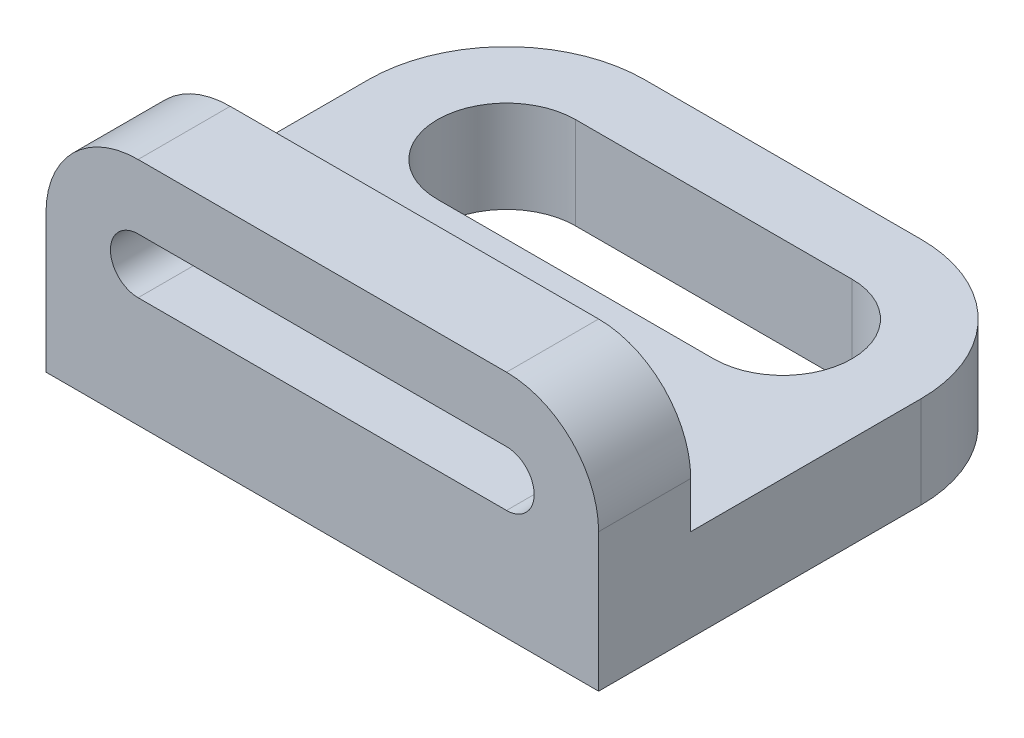
ISO-10303-21;
HEADER;
FILE_DESCRIPTION(('STEP AP214'),'2;1');
FILE_NAME('part.step','',(''),(''),'','','');
FILE_SCHEMA(('AUTOMOTIVE_DESIGN { 1 0 10303 214 1 1 1 1 }'));
ENDSEC;
DATA;
#1=APPLICATION_CONTEXT('core data for automotive mechanical design processes');
#2=APPLICATION_PROTOCOL_DEFINITION('international standard','automotive_design',2000,#1);
#3=PRODUCT_CONTEXT('',#1,'mechanical');
#4=PRODUCT('Part','Part','',(#3));
#5=PRODUCT_RELATED_PRODUCT_CATEGORY('part','',(#4));
#6=PRODUCT_DEFINITION_FORMATION('','',#4);
#7=PRODUCT_DEFINITION_CONTEXT('part definition',#1,'design');
#8=PRODUCT_DEFINITION('design','',#6,#7);
#9=PRODUCT_DEFINITION_SHAPE('','',#8);
#10=(LENGTH_UNIT() NAMED_UNIT(*) SI_UNIT(.MILLI.,.METRE.));
#11=(NAMED_UNIT(*) PLANE_ANGLE_UNIT() SI_UNIT($,.RADIAN.));
#12=(NAMED_UNIT(*) SI_UNIT($,.STERADIAN.) SOLID_ANGLE_UNIT());
#13=UNCERTAINTY_MEASURE_WITH_UNIT(LENGTH_MEASURE(1.E-05),#10,'distance_accuracy_value','');
#14=(GEOMETRIC_REPRESENTATION_CONTEXT(3) GLOBAL_UNCERTAINTY_ASSIGNED_CONTEXT((#13)) GLOBAL_UNIT_ASSIGNED_CONTEXT((#10,
#11,#12)) REPRESENTATION_CONTEXT('',''));
#15=CARTESIAN_POINT('',(0.,0.,0.));
#16=DIRECTION('',(0.,0.,1.));
#17=DIRECTION('',(1.,0.,0.));
#18=AXIS2_PLACEMENT_3D('',#15,#16,#17);
#19=CARTESIAN_POINT('',(120.,50.,0.));
#20=DIRECTION('',(0.,0.,-1.));
#21=DIRECTION('',(0.,1.,0.));
#22=AXIS2_PLACEMENT_3D('',#19,#20,#21);
#23=PLANE('',#22);
#24=DIRECTION('',(-1.,0.,0.));
#25=VECTOR('',#24,1.);
#26=CARTESIAN_POINT('',(20.,24.,0.));
#27=LINE('',#26,#25);
#28=CARTESIAN_POINT('',(100.,24.,0.));
#29=VERTEX_POINT('',#28);
#30=CARTESIAN_POINT('',(20.,24.,0.));
#31=VERTEX_POINT('',#30);
#32=EDGE_CURVE('E169',#29,#31,#27,.T.);
#33=ORIENTED_EDGE('',*,*,#32,.T.);
#34=CARTESIAN_POINT('',(20.,30.,0.));
#35=DIRECTION('',(0.,0.,-1.));
#36=DIRECTION('',(0.,1.,0.));
#37=AXIS2_PLACEMENT_3D('',#34,#35,#36);
#38=CIRCLE('',#37,6.);
#39=CARTESIAN_POINT('',(20.,36.,0.));
#40=VERTEX_POINT('',#39);
#41=EDGE_CURVE('E163',#31,#40,#38,.T.);
#42=ORIENTED_EDGE('',*,*,#41,.T.);
#43=DIRECTION('',(1.,0.,0.));
#44=VECTOR('',#43,1.);
#45=CARTESIAN_POINT('',(20.,36.,0.));
#46=LINE('',#45,#44);
#47=CARTESIAN_POINT('',(100.,36.,0.));
#48=VERTEX_POINT('',#47);
#49=EDGE_CURVE('E172',#40,#48,#46,.T.);
#50=ORIENTED_EDGE('',*,*,#49,.T.);
#51=CARTESIAN_POINT('',(100.,30.,0.));
#52=DIRECTION('',(0.,0.,-1.));
#53=DIRECTION('',(0.,1.,0.));
#54=AXIS2_PLACEMENT_3D('',#51,#52,#53);
#55=CIRCLE('',#54,6.);
#56=EDGE_CURVE('E52',#48,#29,#55,.T.);
#57=ORIENTED_EDGE('',*,*,#56,.T.);
#58=EDGE_LOOP('',(#33,#42,#50,#57));
#59=FACE_BOUND('',#58,.T.);
#60=DIRECTION('',(0.,-1.,0.));
#61=VECTOR('',#60,1.);
#62=CARTESIAN_POINT('',(120.,50.,0.));
#63=LINE('',#62,#61);
#64=CARTESIAN_POINT('',(120.,30.,0.));
#65=VERTEX_POINT('',#64);
#66=CARTESIAN_POINT('',(120.,0.,0.));
#67=VERTEX_POINT('',#66);
#68=EDGE_CURVE('E229',#65,#67,#63,.T.);
#69=ORIENTED_EDGE('',*,*,#68,.F.);
#70=CARTESIAN_POINT('',(100.,30.,0.));
#71=DIRECTION('',(0.,0.,-1.));
#72=DIRECTION('',(0.,1.,0.));
#73=AXIS2_PLACEMENT_3D('',#70,#71,#72);
#74=CIRCLE('',#73,20.);
#75=CARTESIAN_POINT('',(100.,50.,0.));
#76=VERTEX_POINT('',#75);
#77=EDGE_CURVE('E288',#65,#76,#74,.F.);
#78=ORIENTED_EDGE('',*,*,#77,.T.);
#79=DIRECTION('',(-1.,0.,0.));
#80=VECTOR('',#79,1.);
#81=CARTESIAN_POINT('',(120.,50.,0.));
#82=LINE('',#81,#80);
#83=CARTESIAN_POINT('',(20.,50.,0.));
#84=VERTEX_POINT('',#83);
#85=EDGE_CURVE('E240',#76,#84,#82,.T.);
#86=ORIENTED_EDGE('',*,*,#85,.T.);
#87=CARTESIAN_POINT('',(20.,30.,0.));
#88=DIRECTION('',(0.,0.,-1.));
#89=DIRECTION('',(0.,1.,0.));
#90=AXIS2_PLACEMENT_3D('',#87,#88,#89);
#91=CIRCLE('',#90,20.);
#92=CARTESIAN_POINT('',(0.,30.,0.));
#93=VERTEX_POINT('',#92);
#94=EDGE_CURVE('E286',#84,#93,#91,.F.);
#95=ORIENTED_EDGE('',*,*,#94,.T.);
#96=DIRECTION('',(0.,-1.,0.));
#97=VECTOR('',#96,1.);
#98=CARTESIAN_POINT('',(0.,50.,0.));
#99=LINE('',#98,#97);
#100=CARTESIAN_POINT('',(0.,0.,0.));
#101=VERTEX_POINT('',#100);
#102=EDGE_CURVE('E222',#93,#101,#99,.T.);
#103=ORIENTED_EDGE('',*,*,#102,.T.);
#104=DIRECTION('',(-1.,0.,0.));
#105=VECTOR('',#104,1.);
#106=CARTESIAN_POINT('',(120.,0.,0.));
#107=LINE('',#106,#105);
#108=EDGE_CURVE('E261',#67,#101,#107,.T.);
#109=ORIENTED_EDGE('',*,*,#108,.F.);
#110=EDGE_LOOP('',(#69,#78,#86,#95,#103,#109));
#111=FACE_BOUND('',#110,.T.);
#112=ADVANCED_FACE('F37',(#59,#111),#23,.F.);
#113=CARTESIAN_POINT('',(120.,0.,0.));
#114=DIRECTION('',(0.,1.,0.));
#115=DIRECTION('',(0.,0.,1.));
#116=AXIS2_PLACEMENT_3D('',#113,#114,#115);
#117=PLANE('',#116);
#118=DIRECTION('',(-1.,0.,0.));
#119=VECTOR('',#118,1.);
#120=CARTESIAN_POINT('',(30.,0.,-85.));
#121=LINE('',#120,#119);
#122=CARTESIAN_POINT('',(90.,0.,-85.));
#123=VERTEX_POINT('',#122);
#124=CARTESIAN_POINT('',(30.,0.,-85.));
#125=VERTEX_POINT('',#124);
#126=EDGE_CURVE('E207',#123,#125,#121,.T.);
#127=ORIENTED_EDGE('',*,*,#126,.T.);
#128=CARTESIAN_POINT('',(30.,0.,-70.));
#129=DIRECTION('',(0.,1.,0.));
#130=DIRECTION('',(0.,0.,1.));
#131=AXIS2_PLACEMENT_3D('',#128,#129,#130);
#132=CIRCLE('',#131,15.);
#133=CARTESIAN_POINT('',(30.,0.,-55.));
#134=VERTEX_POINT('',#133);
#135=EDGE_CURVE('E197',#125,#134,#132,.T.);
#136=ORIENTED_EDGE('',*,*,#135,.T.);
#137=DIRECTION('',(1.,0.,0.));
#138=VECTOR('',#137,1.);
#139=CARTESIAN_POINT('',(30.,0.,-55.));
#140=LINE('',#139,#138);
#141=CARTESIAN_POINT('',(90.,0.,-55.));
#142=VERTEX_POINT('',#141);
#143=EDGE_CURVE('E200',#134,#142,#140,.T.);
#144=ORIENTED_EDGE('',*,*,#143,.T.);
#145=CARTESIAN_POINT('',(90.,0.,-70.));
#146=DIRECTION('',(0.,1.,0.));
#147=DIRECTION('',(0.,0.,1.));
#148=AXIS2_PLACEMENT_3D('',#145,#146,#147);
#149=CIRCLE('',#148,15.);
#150=EDGE_CURVE('E204',#142,#123,#149,.T.);
#151=ORIENTED_EDGE('',*,*,#150,.T.);
#152=EDGE_LOOP('',(#127,#136,#144,#151));
#153=FACE_BOUND('',#152,.T.);
#154=DIRECTION('',(-1.,0.,0.));
#155=VECTOR('',#154,1.);
#156=CARTESIAN_POINT('',(120.,0.,-100.));
#157=LINE('',#156,#155);
#158=CARTESIAN_POINT('',(90.,0.,-100.));
#159=VERTEX_POINT('',#158);
#160=CARTESIAN_POINT('',(30.,0.,-100.));
#161=VERTEX_POINT('',#160);
#162=EDGE_CURVE('E259',#159,#161,#157,.T.);
#163=ORIENTED_EDGE('',*,*,#162,.F.);
#164=CARTESIAN_POINT('',(90.,0.,-70.));
#165=DIRECTION('',(0.,1.,0.));
#166=DIRECTION('',(0.,0.,1.));
#167=AXIS2_PLACEMENT_3D('',#164,#165,#166);
#168=CIRCLE('',#167,30.);
#169=CARTESIAN_POINT('',(120.,0.,-70.));
#170=VERTEX_POINT('',#169);
#171=EDGE_CURVE('E281',#159,#170,#168,.F.);
#172=ORIENTED_EDGE('',*,*,#171,.T.);
#173=DIRECTION('',(0.,0.,-1.));
#174=VECTOR('',#173,1.);
#175=CARTESIAN_POINT('',(120.,0.,0.));
#176=LINE('',#175,#174);
#177=EDGE_CURVE('E231',#67,#170,#176,.T.);
#178=ORIENTED_EDGE('',*,*,#177,.F.);
#179=ORIENTED_EDGE('',*,*,#108,.T.);
#180=DIRECTION('',(0.,0.,-1.));
#181=VECTOR('',#180,1.);
#182=CARTESIAN_POINT('',(0.,0.,0.));
#183=LINE('',#182,#181);
#184=CARTESIAN_POINT('',(0.,0.,-70.));
#185=VERTEX_POINT('',#184);
#186=EDGE_CURVE('E242',#101,#185,#183,.T.);
#187=ORIENTED_EDGE('',*,*,#186,.T.);
#188=CARTESIAN_POINT('',(30.,0.,-70.));
#189=DIRECTION('',(0.,1.,0.));
#190=DIRECTION('',(0.,0.,1.));
#191=AXIS2_PLACEMENT_3D('',#188,#189,#190);
#192=CIRCLE('',#191,30.);
#193=EDGE_CURVE('E271',#185,#161,#192,.F.);
#194=ORIENTED_EDGE('',*,*,#193,.T.);
#195=EDGE_LOOP('',(#163,#172,#178,#179,#187,#194));
#196=FACE_BOUND('',#195,.T.);
#197=ADVANCED_FACE('F329',(#153,#196),#117,.F.);
#198=CARTESIAN_POINT('',(120.,0.,-100.));
#199=DIRECTION('',(0.,0.,1.));
#200=DIRECTION('',(1.,0.,0.));
#201=AXIS2_PLACEMENT_3D('',#198,#199,#200);
#202=PLANE('',#201);
#203=DIRECTION('',(-1.,0.,0.));
#204=VECTOR('',#203,1.);
#205=CARTESIAN_POINT('',(120.,20.,-100.));
#206=LINE('',#205,#204);
#207=CARTESIAN_POINT('',(90.,20.,-100.));
#208=VERTEX_POINT('',#207);
#209=CARTESIAN_POINT('',(30.,20.,-100.));
#210=VERTEX_POINT('',#209);
#211=EDGE_CURVE('E257',#208,#210,#206,.T.);
#212=ORIENTED_EDGE('',*,*,#211,.F.);
#213=DIRECTION('',(0.,1.,0.));
#214=VECTOR('',#213,1.);
#215=CARTESIAN_POINT('',(90.,0.,-100.));
#216=LINE('',#215,#214);
#217=EDGE_CURVE('E279',#208,#159,#216,.F.);
#218=ORIENTED_EDGE('',*,*,#217,.T.);
#219=ORIENTED_EDGE('',*,*,#162,.T.);
#220=DIRECTION('',(0.,1.,0.));
#221=VECTOR('',#220,1.);
#222=CARTESIAN_POINT('',(30.,0.,-100.));
#223=LINE('',#222,#221);
#224=EDGE_CURVE('E264',#161,#210,#223,.T.);
#225=ORIENTED_EDGE('',*,*,#224,.T.);
#226=EDGE_LOOP('',(#212,#218,#219,#225));
#227=FACE_BOUND('',#226,.T.);
#228=ADVANCED_FACE('F340',(#227),#202,.F.);
#229=CARTESIAN_POINT('',(120.,20.,-100.));
#230=DIRECTION('',(0.,-1.,0.));
#231=DIRECTION('',(0.,0.,-1.));
#232=AXIS2_PLACEMENT_3D('',#229,#230,#231);
#233=PLANE('',#232);
#234=DIRECTION('',(1.,0.,0.));
#235=VECTOR('',#234,1.);
#236=CARTESIAN_POINT('',(30.,20.,-55.));
#237=LINE('',#236,#235);
#238=CARTESIAN_POINT('',(30.,20.,-55.));
#239=VERTEX_POINT('',#238);
#240=CARTESIAN_POINT('',(90.,20.,-55.));
#241=VERTEX_POINT('',#240);
#242=EDGE_CURVE('E212',#239,#241,#237,.T.);
#243=ORIENTED_EDGE('',*,*,#242,.F.);
#244=CARTESIAN_POINT('',(30.,20.,-70.));
#245=DIRECTION('',(0.,1.,0.));
#246=DIRECTION('',(0.,0.,1.));
#247=AXIS2_PLACEMENT_3D('',#244,#245,#246);
#248=CIRCLE('',#247,15.);
#249=CARTESIAN_POINT('',(30.,20.,-85.));
#250=VERTEX_POINT('',#249);
#251=EDGE_CURVE('E193',#250,#239,#248,.T.);
#252=ORIENTED_EDGE('',*,*,#251,.F.);
#253=DIRECTION('',(-1.,0.,0.));
#254=VECTOR('',#253,1.);
#255=CARTESIAN_POINT('',(30.,20.,-85.));
#256=LINE('',#255,#254);
#257=CARTESIAN_POINT('',(90.,20.,-85.));
#258=VERTEX_POINT('',#257);
#259=EDGE_CURVE('E201',#258,#250,#256,.T.);
#260=ORIENTED_EDGE('',*,*,#259,.F.);
#261=CARTESIAN_POINT('',(90.,20.,-70.));
#262=DIRECTION('',(0.,1.,0.));
#263=DIRECTION('',(0.,0.,1.));
#264=AXIS2_PLACEMENT_3D('',#261,#262,#263);
#265=CIRCLE('',#264,15.);
#266=EDGE_CURVE('E215',#241,#258,#265,.T.);
#267=ORIENTED_EDGE('',*,*,#266,.F.);
#268=EDGE_LOOP('',(#243,#252,#260,#267));
#269=FACE_BOUND('',#268,.T.);
#270=DIRECTION('',(0.,0.,1.));
#271=VECTOR('',#270,1.);
#272=CARTESIAN_POINT('',(120.,20.,-100.));
#273=LINE('',#272,#271);
#274=CARTESIAN_POINT('',(120.,20.,-70.));
#275=VERTEX_POINT('',#274);
#276=CARTESIAN_POINT('',(120.,20.,-20.));
#277=VERTEX_POINT('',#276);
#278=EDGE_CURVE('E235',#275,#277,#273,.T.);
#279=ORIENTED_EDGE('',*,*,#278,.F.);
#280=CARTESIAN_POINT('',(90.,20.,-70.));
#281=DIRECTION('',(0.,-1.,0.));
#282=DIRECTION('',(0.,0.,-1.));
#283=AXIS2_PLACEMENT_3D('',#280,#281,#282);
#284=CIRCLE('',#283,30.);
#285=EDGE_CURVE('E277',#275,#208,#284,.F.);
#286=ORIENTED_EDGE('',*,*,#285,.T.);
#287=ORIENTED_EDGE('',*,*,#211,.T.);
#288=CARTESIAN_POINT('',(30.,20.,-70.));
#289=DIRECTION('',(0.,-1.,0.));
#290=DIRECTION('',(0.,0.,-1.));
#291=AXIS2_PLACEMENT_3D('',#288,#289,#290);
#292=CIRCLE('',#291,30.);
#293=CARTESIAN_POINT('',(0.,20.,-70.));
#294=VERTEX_POINT('',#293);
#295=EDGE_CURVE('E267',#210,#294,#292,.F.);
#296=ORIENTED_EDGE('',*,*,#295,.T.);
#297=DIRECTION('',(0.,0.,1.));
#298=VECTOR('',#297,1.);
#299=CARTESIAN_POINT('',(0.,20.,-100.));
#300=LINE('',#299,#298);
#301=CARTESIAN_POINT('',(0.,20.,-20.));
#302=VERTEX_POINT('',#301);
#303=EDGE_CURVE('E245',#294,#302,#300,.T.);
#304=ORIENTED_EDGE('',*,*,#303,.T.);
#305=DIRECTION('',(-1.,0.,0.));
#306=VECTOR('',#305,1.);
#307=CARTESIAN_POINT('',(120.,20.,-20.));
#308=LINE('',#307,#306);
#309=EDGE_CURVE('E254',#277,#302,#308,.T.);
#310=ORIENTED_EDGE('',*,*,#309,.F.);
#311=EDGE_LOOP('',(#279,#286,#287,#296,#304,#310));
#312=FACE_BOUND('',#311,.T.);
#313=ADVANCED_FACE('F337',(#269,#312),#233,.F.);
#314=CARTESIAN_POINT('',(120.,20.,-20.));
#315=DIRECTION('',(0.,0.,1.));
#316=DIRECTION('',(0.,-1.,0.));
#317=AXIS2_PLACEMENT_3D('',#314,#315,#316);
#318=PLANE('',#317);
#319=DIRECTION('',(1.,0.,0.));
#320=VECTOR('',#319,1.);
#321=CARTESIAN_POINT('',(20.,36.,-20.));
#322=LINE('',#321,#320);
#323=CARTESIAN_POINT('',(20.,36.,-20.));
#324=VERTEX_POINT('',#323);
#325=CARTESIAN_POINT('',(100.,36.,-20.));
#326=VERTEX_POINT('',#325);
#327=EDGE_CURVE('E187',#324,#326,#322,.T.);
#328=ORIENTED_EDGE('',*,*,#327,.F.);
#329=CARTESIAN_POINT('',(20.,30.,-20.));
#330=DIRECTION('',(0.,0.,-1.));
#331=DIRECTION('',(0.,1.,0.));
#332=AXIS2_PLACEMENT_3D('',#329,#330,#331);
#333=CIRCLE('',#332,6.);
#334=CARTESIAN_POINT('',(20.,24.,-20.));
#335=VERTEX_POINT('',#334);
#336=EDGE_CURVE('E60',#335,#324,#333,.T.);
#337=ORIENTED_EDGE('',*,*,#336,.F.);
#338=DIRECTION('',(-1.,0.,0.));
#339=VECTOR('',#338,1.);
#340=CARTESIAN_POINT('',(20.,24.,-20.));
#341=LINE('',#340,#339);
#342=CARTESIAN_POINT('',(100.,24.,-20.));
#343=VERTEX_POINT('',#342);
#344=EDGE_CURVE('E178',#343,#335,#341,.T.);
#345=ORIENTED_EDGE('',*,*,#344,.F.);
#346=CARTESIAN_POINT('',(100.,30.,-20.));
#347=DIRECTION('',(0.,0.,-1.));
#348=DIRECTION('',(0.,1.,0.));
#349=AXIS2_PLACEMENT_3D('',#346,#347,#348);
#350=CIRCLE('',#349,6.);
#351=EDGE_CURVE('E181',#326,#343,#350,.T.);
#352=ORIENTED_EDGE('',*,*,#351,.F.);
#353=EDGE_LOOP('',(#328,#337,#345,#352));
#354=FACE_BOUND('',#353,.T.);
#355=DIRECTION('',(-1.,0.,0.));
#356=VECTOR('',#355,1.);
#357=CARTESIAN_POINT('',(120.,50.,-20.));
#358=LINE('',#357,#356);
#359=CARTESIAN_POINT('',(100.,50.,-20.));
#360=VERTEX_POINT('',#359);
#361=CARTESIAN_POINT('',(20.,50.,-20.));
#362=VERTEX_POINT('',#361);
#363=EDGE_CURVE('E251',#360,#362,#358,.T.);
#364=ORIENTED_EDGE('',*,*,#363,.F.);
#365=CARTESIAN_POINT('',(100.,30.,-20.));
#366=DIRECTION('',(0.,0.,1.));
#367=DIRECTION('',(0.,-1.,0.));
#368=AXIS2_PLACEMENT_3D('',#365,#366,#367);
#369=CIRCLE('',#368,20.);
#370=CARTESIAN_POINT('',(120.,30.,-20.));
#371=VERTEX_POINT('',#370);
#372=EDGE_CURVE('E45',#360,#371,#369,.F.);
#373=ORIENTED_EDGE('',*,*,#372,.T.);
#374=DIRECTION('',(0.,1.,0.));
#375=VECTOR('',#374,1.);
#376=CARTESIAN_POINT('',(120.,20.,-20.));
#377=LINE('',#376,#375);
#378=EDGE_CURVE('E237',#277,#371,#377,.T.);
#379=ORIENTED_EDGE('',*,*,#378,.F.);
#380=ORIENTED_EDGE('',*,*,#309,.T.);
#381=DIRECTION('',(0.,1.,0.));
#382=VECTOR('',#381,1.);
#383=CARTESIAN_POINT('',(0.,20.,-20.));
#384=LINE('',#383,#382);
#385=CARTESIAN_POINT('',(0.,30.,-20.));
#386=VERTEX_POINT('',#385);
#387=EDGE_CURVE('E232',#302,#386,#384,.T.);
#388=ORIENTED_EDGE('',*,*,#387,.T.);
#389=CARTESIAN_POINT('',(20.,30.,-20.));
#390=DIRECTION('',(0.,0.,1.));
#391=DIRECTION('',(0.,-1.,0.));
#392=AXIS2_PLACEMENT_3D('',#389,#390,#391);
#393=CIRCLE('',#392,20.);
#394=EDGE_CURVE('E295',#386,#362,#393,.F.);
#395=ORIENTED_EDGE('',*,*,#394,.T.);
#396=EDGE_LOOP('',(#364,#373,#379,#380,#388,#395));
#397=FACE_BOUND('',#396,.T.);
#398=ADVANCED_FACE('F300',(#354,#397),#318,.F.);
#399=CARTESIAN_POINT('',(120.,50.,-20.));
#400=DIRECTION('',(0.,-1.,0.));
#401=DIRECTION('',(0.,0.,-1.));
#402=AXIS2_PLACEMENT_3D('',#399,#400,#401);
#403=PLANE('',#402);
#404=ORIENTED_EDGE('',*,*,#85,.F.);
#405=DIRECTION('',(0.,0.,1.));
#406=VECTOR('',#405,1.);
#407=CARTESIAN_POINT('',(100.,50.,-20.));
#408=LINE('',#407,#406);
#409=EDGE_CURVE('E293',#76,#360,#408,.F.);
#410=ORIENTED_EDGE('',*,*,#409,.T.);
#411=ORIENTED_EDGE('',*,*,#363,.T.);
#412=DIRECTION('',(0.,0.,1.));
#413=VECTOR('',#412,1.);
#414=CARTESIAN_POINT('',(20.,50.,-20.));
#415=LINE('',#414,#413);
#416=EDGE_CURVE('E290',#362,#84,#415,.T.);
#417=ORIENTED_EDGE('',*,*,#416,.T.);
#418=EDGE_LOOP('',(#404,#410,#411,#417));
#419=FACE_BOUND('',#418,.T.);
#420=ADVANCED_FACE('F313',(#419),#403,.F.);
#421=CARTESIAN_POINT('',(120.,0.,0.));
#422=DIRECTION('',(1.,0.,0.));
#423=DIRECTION('',(0.,0.,-1.));
#424=AXIS2_PLACEMENT_3D('',#421,#422,#423);
#425=PLANE('',#424);
#426=ORIENTED_EDGE('',*,*,#378,.T.);
#427=DIRECTION('',(0.,0.,1.));
#428=VECTOR('',#427,1.);
#429=CARTESIAN_POINT('',(120.,30.,0.));
#430=LINE('',#429,#428);
#431=EDGE_CURVE('E283',#371,#65,#430,.T.);
#432=ORIENTED_EDGE('',*,*,#431,.T.);
#433=ORIENTED_EDGE('',*,*,#68,.T.);
#434=ORIENTED_EDGE('',*,*,#177,.T.);
#435=DIRECTION('',(0.,1.,0.));
#436=VECTOR('',#435,1.);
#437=CARTESIAN_POINT('',(120.,20.,-70.));
#438=LINE('',#437,#436);
#439=EDGE_CURVE('E274',#170,#275,#438,.T.);
#440=ORIENTED_EDGE('',*,*,#439,.T.);
#441=ORIENTED_EDGE('',*,*,#278,.T.);
#442=EDGE_LOOP('',(#426,#432,#433,#434,#440,#441));
#443=FACE_BOUND('',#442,.T.);
#444=ADVANCED_FACE('F305',(#443),#425,.T.);
#445=CARTESIAN_POINT('',(0.,0.,0.));
#446=DIRECTION('',(1.,0.,0.));
#447=DIRECTION('',(0.,0.,-1.));
#448=AXIS2_PLACEMENT_3D('',#445,#446,#447);
#449=PLANE('',#448);
#450=ORIENTED_EDGE('',*,*,#102,.F.);
#451=DIRECTION('',(0.,0.,1.));
#452=VECTOR('',#451,1.);
#453=CARTESIAN_POINT('',(0.,30.,0.));
#454=LINE('',#453,#452);
#455=EDGE_CURVE('E11',#93,#386,#454,.F.);
#456=ORIENTED_EDGE('',*,*,#455,.T.);
#457=ORIENTED_EDGE('',*,*,#387,.F.);
#458=ORIENTED_EDGE('',*,*,#303,.F.);
#459=DIRECTION('',(0.,1.,0.));
#460=VECTOR('',#459,1.);
#461=CARTESIAN_POINT('',(0.,0.,-70.));
#462=LINE('',#461,#460);
#463=EDGE_CURVE('E269',#294,#185,#462,.F.);
#464=ORIENTED_EDGE('',*,*,#463,.T.);
#465=ORIENTED_EDGE('',*,*,#186,.F.);
#466=EDGE_LOOP('',(#450,#456,#457,#458,#464,#465));
#467=FACE_BOUND('',#466,.T.);
#468=ADVANCED_FACE('F321',(#467),#449,.F.);
#469=CARTESIAN_POINT('',(30.,0.,-70.));
#470=DIRECTION('',(0.,1.,0.));
#471=DIRECTION('',(0.,0.,1.));
#472=AXIS2_PLACEMENT_3D('',#469,#470,#471);
#473=CYLINDRICAL_SURFACE('',#472,15.);
#474=ORIENTED_EDGE('',*,*,#251,.T.);
#475=DIRECTION('',(0.,1.,0.));
#476=VECTOR('',#475,1.);
#477=CARTESIAN_POINT('',(30.,0.,-55.));
#478=LINE('',#477,#476);
#479=EDGE_CURVE('E210',#134,#239,#478,.T.);
#480=ORIENTED_EDGE('',*,*,#479,.F.);
#481=ORIENTED_EDGE('',*,*,#135,.F.);
#482=DIRECTION('',(0.,1.,0.));
#483=VECTOR('',#482,1.);
#484=CARTESIAN_POINT('',(30.,0.,-85.));
#485=LINE('',#484,#483);
#486=EDGE_CURVE('E220',#125,#250,#485,.T.);
#487=ORIENTED_EDGE('',*,*,#486,.T.);
#488=EDGE_LOOP('',(#474,#480,#481,#487));
#489=FACE_BOUND('',#488,.T.);
#490=ADVANCED_FACE('F375',(#489),#473,.F.);
#491=CARTESIAN_POINT('',(30.,0.,-85.));
#492=DIRECTION('',(0.,0.,-1.));
#493=DIRECTION('',(0.,1.,0.));
#494=AXIS2_PLACEMENT_3D('',#491,#492,#493);
#495=PLANE('',#494);
#496=ORIENTED_EDGE('',*,*,#259,.T.);
#497=ORIENTED_EDGE('',*,*,#486,.F.);
#498=ORIENTED_EDGE('',*,*,#126,.F.);
#499=DIRECTION('',(0.,1.,0.));
#500=VECTOR('',#499,1.);
#501=CARTESIAN_POINT('',(90.,0.,-85.));
#502=LINE('',#501,#500);
#503=EDGE_CURVE('E223',#123,#258,#502,.T.);
#504=ORIENTED_EDGE('',*,*,#503,.T.);
#505=EDGE_LOOP('',(#496,#497,#498,#504));
#506=FACE_BOUND('',#505,.T.);
#507=ADVANCED_FACE('F379',(#506),#495,.F.);
#508=CARTESIAN_POINT('',(90.,0.,-70.));
#509=DIRECTION('',(0.,1.,0.));
#510=DIRECTION('',(0.,0.,1.));
#511=AXIS2_PLACEMENT_3D('',#508,#509,#510);
#512=CYLINDRICAL_SURFACE('',#511,15.);
#513=ORIENTED_EDGE('',*,*,#266,.T.);
#514=ORIENTED_EDGE('',*,*,#503,.F.);
#515=ORIENTED_EDGE('',*,*,#150,.F.);
#516=DIRECTION('',(0.,1.,0.));
#517=VECTOR('',#516,1.);
#518=CARTESIAN_POINT('',(90.,0.,-55.));
#519=LINE('',#518,#517);
#520=EDGE_CURVE('E225',#142,#241,#519,.T.);
#521=ORIENTED_EDGE('',*,*,#520,.T.);
#522=EDGE_LOOP('',(#513,#514,#515,#521));
#523=FACE_BOUND('',#522,.T.);
#524=ADVANCED_FACE('F352',(#523),#512,.F.);
#525=CARTESIAN_POINT('',(30.,0.,-55.));
#526=DIRECTION('',(0.,0.,1.));
#527=DIRECTION('',(0.,-1.,0.));
#528=AXIS2_PLACEMENT_3D('',#525,#526,#527);
#529=PLANE('',#528);
#530=ORIENTED_EDGE('',*,*,#242,.T.);
#531=ORIENTED_EDGE('',*,*,#520,.F.);
#532=ORIENTED_EDGE('',*,*,#143,.F.);
#533=ORIENTED_EDGE('',*,*,#479,.T.);
#534=EDGE_LOOP('',(#530,#531,#532,#533));
#535=FACE_BOUND('',#534,.T.);
#536=ADVANCED_FACE('F345',(#535),#529,.F.);
#537=CARTESIAN_POINT('',(30.,0.,-70.));
#538=DIRECTION('',(0.,1.,0.));
#539=DIRECTION('',(0.,0.,1.));
#540=AXIS2_PLACEMENT_3D('',#537,#538,#539);
#541=CYLINDRICAL_SURFACE('',#540,30.);
#542=ORIENTED_EDGE('',*,*,#193,.F.);
#543=ORIENTED_EDGE('',*,*,#463,.F.);
#544=ORIENTED_EDGE('',*,*,#295,.F.);
#545=ORIENTED_EDGE('',*,*,#224,.F.);
#546=EDGE_LOOP('',(#542,#543,#544,#545));
#547=FACE_BOUND('',#546,.T.);
#548=ADVANCED_FACE('F343',(#547),#541,.T.);
#549=CARTESIAN_POINT('',(90.,0.,-70.));
#550=DIRECTION('',(0.,-1.,0.));
#551=DIRECTION('',(0.,0.,-1.));
#552=AXIS2_PLACEMENT_3D('',#549,#550,#551);
#553=CYLINDRICAL_SURFACE('',#552,30.);
#554=ORIENTED_EDGE('',*,*,#171,.F.);
#555=ORIENTED_EDGE('',*,*,#217,.F.);
#556=ORIENTED_EDGE('',*,*,#285,.F.);
#557=ORIENTED_EDGE('',*,*,#439,.F.);
#558=EDGE_LOOP('',(#554,#555,#556,#557));
#559=FACE_BOUND('',#558,.T.);
#560=ADVANCED_FACE('F333',(#559),#553,.T.);
#561=CARTESIAN_POINT('',(100.,30.,0.));
#562=DIRECTION('',(0.,0.,-1.));
#563=DIRECTION('',(-1.,0.,0.));
#564=AXIS2_PLACEMENT_3D('',#561,#562,#563);
#565=CYLINDRICAL_SURFACE('',#564,20.);
#566=ORIENTED_EDGE('',*,*,#372,.F.);
#567=ORIENTED_EDGE('',*,*,#409,.F.);
#568=ORIENTED_EDGE('',*,*,#77,.F.);
#569=ORIENTED_EDGE('',*,*,#431,.F.);
#570=EDGE_LOOP('',(#566,#567,#568,#569));
#571=FACE_BOUND('',#570,.T.);
#572=ADVANCED_FACE('F309',(#571),#565,.T.);
#573=CARTESIAN_POINT('',(20.,30.,-20.));
#574=DIRECTION('',(0.,0.,1.));
#575=DIRECTION('',(1.,0.,0.));
#576=AXIS2_PLACEMENT_3D('',#573,#574,#575);
#577=CYLINDRICAL_SURFACE('',#576,20.);
#578=ORIENTED_EDGE('',*,*,#394,.F.);
#579=ORIENTED_EDGE('',*,*,#455,.F.);
#580=ORIENTED_EDGE('',*,*,#94,.F.);
#581=ORIENTED_EDGE('',*,*,#416,.F.);
#582=EDGE_LOOP('',(#578,#579,#580,#581));
#583=FACE_BOUND('',#582,.T.);
#584=ADVANCED_FACE('F39',(#583),#577,.T.);
#585=CARTESIAN_POINT('',(20.,30.,0.));
#586=DIRECTION('',(0.,0.,-1.));
#587=DIRECTION('',(0.,1.,0.));
#588=AXIS2_PLACEMENT_3D('',#585,#586,#587);
#589=CYLINDRICAL_SURFACE('',#588,6.);
#590=ORIENTED_EDGE('',*,*,#336,.T.);
#591=DIRECTION('',(0.,0.,-1.));
#592=VECTOR('',#591,1.);
#593=CARTESIAN_POINT('',(20.,36.,0.));
#594=LINE('',#593,#592);
#595=EDGE_CURVE('E159',#40,#324,#594,.T.);
#596=ORIENTED_EDGE('',*,*,#595,.F.);
#597=ORIENTED_EDGE('',*,*,#41,.F.);
#598=DIRECTION('',(0.,0.,-1.));
#599=VECTOR('',#598,1.);
#600=CARTESIAN_POINT('',(20.,24.,0.));
#601=LINE('',#600,#599);
#602=EDGE_CURVE('E191',#31,#335,#601,.T.);
#603=ORIENTED_EDGE('',*,*,#602,.T.);
#604=EDGE_LOOP('',(#590,#596,#597,#603));
#605=FACE_BOUND('',#604,.T.);
#606=ADVANCED_FACE('F161',(#605),#589,.F.);
#607=CARTESIAN_POINT('',(20.,24.,0.));
#608=DIRECTION('',(0.,-1.,0.));
#609=DIRECTION('',(1.,0.,0.));
#610=AXIS2_PLACEMENT_3D('',#607,#608,#609);
#611=PLANE('',#610);
#612=ORIENTED_EDGE('',*,*,#344,.T.);
#613=ORIENTED_EDGE('',*,*,#602,.F.);
#614=ORIENTED_EDGE('',*,*,#32,.F.);
#615=DIRECTION('',(0.,0.,-1.));
#616=VECTOR('',#615,1.);
#617=CARTESIAN_POINT('',(100.,24.,0.));
#618=LINE('',#617,#616);
#619=EDGE_CURVE('E194',#29,#343,#618,.T.);
#620=ORIENTED_EDGE('',*,*,#619,.T.);
#621=EDGE_LOOP('',(#612,#613,#614,#620));
#622=FACE_BOUND('',#621,.T.);
#623=ADVANCED_FACE('F390',(#622),#611,.F.);
#624=CARTESIAN_POINT('',(100.,30.,0.));
#625=DIRECTION('',(0.,0.,-1.));
#626=DIRECTION('',(0.,1.,0.));
#627=AXIS2_PLACEMENT_3D('',#624,#625,#626);
#628=CYLINDRICAL_SURFACE('',#627,6.);
#629=ORIENTED_EDGE('',*,*,#351,.T.);
#630=ORIENTED_EDGE('',*,*,#619,.F.);
#631=ORIENTED_EDGE('',*,*,#56,.F.);
#632=DIRECTION('',(0.,0.,-1.));
#633=VECTOR('',#632,1.);
#634=CARTESIAN_POINT('',(100.,36.,0.));
#635=LINE('',#634,#633);
#636=EDGE_CURVE('E168',#48,#326,#635,.T.);
#637=ORIENTED_EDGE('',*,*,#636,.T.);
#638=EDGE_LOOP('',(#629,#630,#631,#637));
#639=FACE_BOUND('',#638,.T.);
#640=ADVANCED_FACE('F393',(#639),#628,.F.);
#641=CARTESIAN_POINT('',(20.,36.,0.));
#642=DIRECTION('',(0.,1.,0.));
#643=DIRECTION('',(0.,0.,1.));
#644=AXIS2_PLACEMENT_3D('',#641,#642,#643);
#645=PLANE('',#644);
#646=ORIENTED_EDGE('',*,*,#327,.T.);
#647=ORIENTED_EDGE('',*,*,#636,.F.);
#648=ORIENTED_EDGE('',*,*,#49,.F.);
#649=ORIENTED_EDGE('',*,*,#595,.T.);
#650=EDGE_LOOP('',(#646,#647,#648,#649));
#651=FACE_BOUND('',#650,.T.);
#652=ADVANCED_FACE('F173',(#651),#645,.F.);
#653=CLOSED_SHELL('',(#112,#197,#228,#313,#398,#420,#444,#468,#490,#507,#524,#536,#548,#560,
#572,#584,#606,#623,#640,#652));
#654=MANIFOLD_SOLID_BREP('B2',#653);
#655=ADVANCED_BREP_SHAPE_REPRESENTATION('',(#18,#654),#14);
#656=SHAPE_DEFINITION_REPRESENTATION(#9,#655);
ENDSEC;
END-ISO-10303-21;
